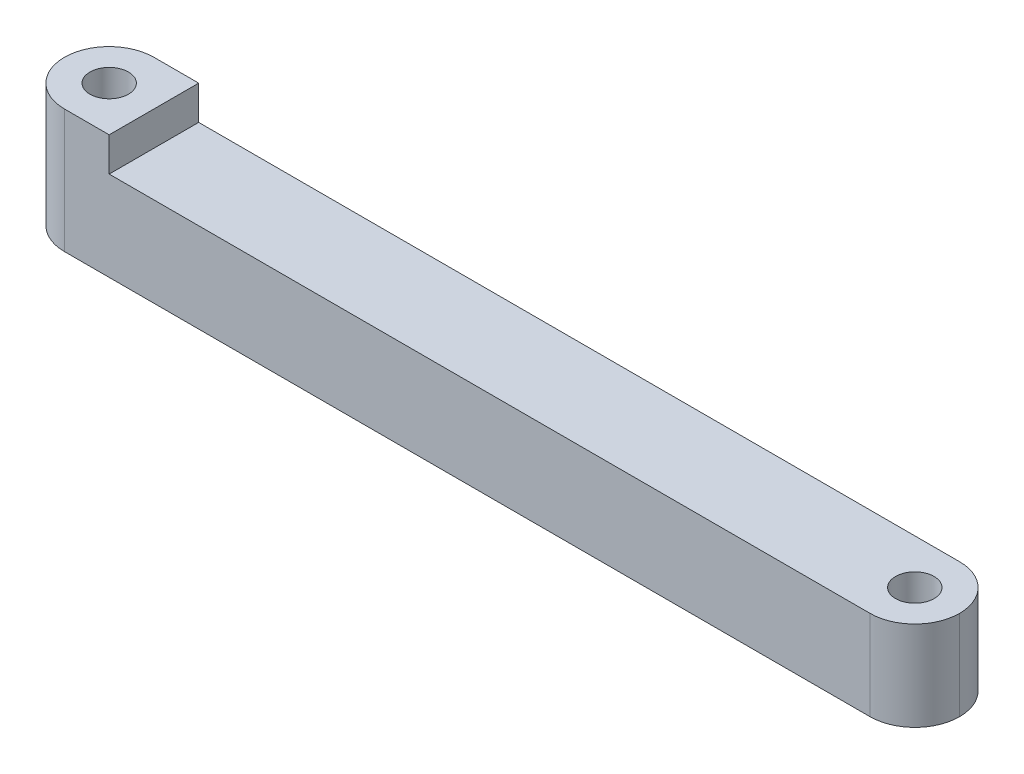
ISO-10303-21;
HEADER;
FILE_DESCRIPTION(('STEP AP214'),'2;1');
FILE_NAME('part.step','',(''),(''),'','','');
FILE_SCHEMA(('AUTOMOTIVE_DESIGN { 1 0 10303 214 1 1 1 1 }'));
ENDSEC;
DATA;
#1=APPLICATION_CONTEXT('core data for automotive mechanical design processes');
#2=APPLICATION_PROTOCOL_DEFINITION('international standard','automotive_design',2000,#1);
#3=PRODUCT_CONTEXT('',#1,'mechanical');
#4=PRODUCT('Part','Part','',(#3));
#5=PRODUCT_RELATED_PRODUCT_CATEGORY('part','',(#4));
#6=PRODUCT_DEFINITION_FORMATION('','',#4);
#7=PRODUCT_DEFINITION_CONTEXT('part definition',#1,'design');
#8=PRODUCT_DEFINITION('design','',#6,#7);
#9=PRODUCT_DEFINITION_SHAPE('','',#8);
#10=(LENGTH_UNIT() NAMED_UNIT(*) SI_UNIT(.MILLI.,.METRE.));
#11=(NAMED_UNIT(*) PLANE_ANGLE_UNIT() SI_UNIT($,.RADIAN.));
#12=(NAMED_UNIT(*) SI_UNIT($,.STERADIAN.) SOLID_ANGLE_UNIT());
#13=UNCERTAINTY_MEASURE_WITH_UNIT(LENGTH_MEASURE(1.E-05),#10,'distance_accuracy_value','');
#14=(GEOMETRIC_REPRESENTATION_CONTEXT(3) GLOBAL_UNCERTAINTY_ASSIGNED_CONTEXT((#13)) GLOBAL_UNIT_ASSIGNED_CONTEXT((#10,
#11,#12)) REPRESENTATION_CONTEXT('',''));
#15=CARTESIAN_POINT('',(0.,0.,0.));
#16=DIRECTION('',(0.,0.,1.));
#17=DIRECTION('',(1.,0.,0.));
#18=AXIS2_PLACEMENT_3D('',#15,#16,#17);
#19=CARTESIAN_POINT('',(-50.,5.,10.));
#20=DIRECTION('',(0.,-1.,0.));
#21=DIRECTION('',(0.,0.,-1.));
#22=AXIS2_PLACEMENT_3D('',#19,#20,#21);
#23=PLANE('',#22);
#24=CARTESIAN_POINT('',(45.,5.,5.));
#25=DIRECTION('',(0.,-1.,0.));
#26=DIRECTION('',(0.,0.,-1.));
#27=AXIS2_PLACEMENT_3D('',#24,#25,#26);
#28=CIRCLE('',#27,2.15);
#29=CARTESIAN_POINT('',(45.,5.,2.85));
#30=VERTEX_POINT('',#29);
#31=EDGE_CURVE('E194',#30,#30,#28,.T.);
#32=ORIENTED_EDGE('',*,*,#31,.T.);
#33=EDGE_LOOP('',(#32));
#34=FACE_BOUND('',#33,.T.);
#35=DIRECTION('',(-1.,0.,0.));
#36=VECTOR('',#35,1.);
#37=CARTESIAN_POINT('',(-50.,5.,10.));
#38=LINE('',#37,#36);
#39=CARTESIAN_POINT('',(45.,5.,10.));
#40=VERTEX_POINT('',#39);
#41=CARTESIAN_POINT('',(-40.,5.,10.));
#42=VERTEX_POINT('',#41);
#43=EDGE_CURVE('E145',#40,#42,#38,.T.);
#44=ORIENTED_EDGE('',*,*,#43,.F.);
#45=CARTESIAN_POINT('',(45.,5.,5.));
#46=DIRECTION('',(0.,-1.,0.));
#47=DIRECTION('',(0.,0.,-1.));
#48=AXIS2_PLACEMENT_3D('',#45,#46,#47);
#49=CIRCLE('',#48,5.);
#50=CARTESIAN_POINT('',(50.,5.,5.));
#51=VERTEX_POINT('',#50);
#52=EDGE_CURVE('E165',#40,#51,#49,.F.);
#53=ORIENTED_EDGE('',*,*,#52,.T.);
#54=CARTESIAN_POINT('',(45.,5.,5.));
#55=DIRECTION('',(0.,-1.,0.));
#56=DIRECTION('',(0.,0.,-1.));
#57=AXIS2_PLACEMENT_3D('',#54,#55,#56);
#58=CIRCLE('',#57,5.);
#59=CARTESIAN_POINT('',(45.,5.,0.));
#60=VERTEX_POINT('',#59);
#61=EDGE_CURVE('E162',#51,#60,#58,.F.);
#62=ORIENTED_EDGE('',*,*,#61,.T.);
#63=DIRECTION('',(-1.,0.,0.));
#64=VECTOR('',#63,1.);
#65=CARTESIAN_POINT('',(-50.,5.,0.));
#66=LINE('',#65,#64);
#67=CARTESIAN_POINT('',(-40.,5.,0.));
#68=VERTEX_POINT('',#67);
#69=EDGE_CURVE('E135',#60,#68,#66,.T.);
#70=ORIENTED_EDGE('',*,*,#69,.T.);
#71=DIRECTION('',(0.,0.,-1.));
#72=VECTOR('',#71,1.);
#73=CARTESIAN_POINT('',(-40.,5.,0.));
#74=LINE('',#73,#72);
#75=EDGE_CURVE('E130',#42,#68,#74,.T.);
#76=ORIENTED_EDGE('',*,*,#75,.F.);
#77=EDGE_LOOP('',(#44,#53,#62,#70,#76));
#78=FACE_BOUND('',#77,.T.);
#79=ADVANCED_FACE('F45',(#34,#78),#23,.F.);
#80=CARTESIAN_POINT('',(-50.,-5.,10.));
#81=DIRECTION('',(0.,1.,0.));
#82=DIRECTION('',(0.,0.,1.));
#83=AXIS2_PLACEMENT_3D('',#80,#81,#82);
#84=PLANE('',#83);
#85=CARTESIAN_POINT('',(-45.,-5.,5.));
#86=DIRECTION('',(0.,1.,0.));
#87=DIRECTION('',(0.,0.,1.));
#88=AXIS2_PLACEMENT_3D('',#85,#86,#87);
#89=CIRCLE('',#88,2.15);
#90=CARTESIAN_POINT('',(-45.,-5.,7.15));
#91=VERTEX_POINT('',#90);
#92=EDGE_CURVE('E199',#91,#91,#89,.T.);
#93=ORIENTED_EDGE('',*,*,#92,.T.);
#94=EDGE_LOOP('',(#93));
#95=FACE_BOUND('',#94,.T.);
#96=CARTESIAN_POINT('',(45.,-5.,5.));
#97=DIRECTION('',(0.,1.,0.));
#98=DIRECTION('',(0.,0.,1.));
#99=AXIS2_PLACEMENT_3D('',#96,#97,#98);
#100=CIRCLE('',#99,2.15);
#101=CARTESIAN_POINT('',(45.,-5.,7.15));
#102=VERTEX_POINT('',#101);
#103=EDGE_CURVE('E208',#102,#102,#100,.T.);
#104=ORIENTED_EDGE('',*,*,#103,.T.);
#105=EDGE_LOOP('',(#104));
#106=FACE_BOUND('',#105,.T.);
#107=CARTESIAN_POINT('',(45.,-5.,5.));
#108=DIRECTION('',(0.,1.,0.));
#109=DIRECTION('',(0.,0.,1.));
#110=AXIS2_PLACEMENT_3D('',#107,#108,#109);
#111=CIRCLE('',#110,5.);
#112=CARTESIAN_POINT('',(45.,-5.,0.));
#113=VERTEX_POINT('',#112);
#114=CARTESIAN_POINT('',(50.,-5.,5.));
#115=VERTEX_POINT('',#114);
#116=EDGE_CURVE('E174',#113,#115,#111,.F.);
#117=ORIENTED_EDGE('',*,*,#116,.T.);
#118=CARTESIAN_POINT('',(45.,-5.,5.));
#119=DIRECTION('',(0.,1.,0.));
#120=DIRECTION('',(0.,0.,1.));
#121=AXIS2_PLACEMENT_3D('',#118,#119,#120);
#122=CIRCLE('',#121,5.);
#123=CARTESIAN_POINT('',(45.,-5.,10.));
#124=VERTEX_POINT('',#123);
#125=EDGE_CURVE('E177',#115,#124,#122,.F.);
#126=ORIENTED_EDGE('',*,*,#125,.T.);
#127=DIRECTION('',(1.,0.,0.));
#128=VECTOR('',#127,1.);
#129=CARTESIAN_POINT('',(-50.,-5.,10.));
#130=LINE('',#129,#128);
#131=CARTESIAN_POINT('',(-45.,-5.,10.));
#132=VERTEX_POINT('',#131);
#133=EDGE_CURVE('E148',#132,#124,#130,.T.);
#134=ORIENTED_EDGE('',*,*,#133,.F.);
#135=CARTESIAN_POINT('',(-45.,-5.,5.));
#136=DIRECTION('',(0.,1.,0.));
#137=DIRECTION('',(0.,0.,1.));
#138=AXIS2_PLACEMENT_3D('',#135,#136,#137);
#139=CIRCLE('',#138,5.);
#140=CARTESIAN_POINT('',(-50.,-5.,5.));
#141=VERTEX_POINT('',#140);
#142=EDGE_CURVE('E168',#132,#141,#139,.F.);
#143=ORIENTED_EDGE('',*,*,#142,.T.);
#144=CARTESIAN_POINT('',(-45.,-5.,5.));
#145=DIRECTION('',(0.,1.,0.));
#146=DIRECTION('',(0.,0.,1.));
#147=AXIS2_PLACEMENT_3D('',#144,#145,#146);
#148=CIRCLE('',#147,5.);
#149=CARTESIAN_POINT('',(-45.,-5.,0.));
#150=VERTEX_POINT('',#149);
#151=EDGE_CURVE('E171',#141,#150,#148,.F.);
#152=ORIENTED_EDGE('',*,*,#151,.T.);
#153=DIRECTION('',(1.,0.,0.));
#154=VECTOR('',#153,1.);
#155=CARTESIAN_POINT('',(-50.,-5.,0.));
#156=LINE('',#155,#154);
#157=EDGE_CURVE('E140',#150,#113,#156,.T.);
#158=ORIENTED_EDGE('',*,*,#157,.T.);
#159=EDGE_LOOP('',(#117,#126,#134,#143,#152,#158));
#160=FACE_BOUND('',#159,.T.);
#161=ADVANCED_FACE('F235',(#95,#106,#160),#84,.F.);
#162=CARTESIAN_POINT('',(0.,0.,10.));
#163=DIRECTION('',(0.,0.,-1.));
#164=DIRECTION('',(-1.,0.,0.));
#165=AXIS2_PLACEMENT_3D('',#162,#163,#164);
#166=PLANE('',#165);
#167=ORIENTED_EDGE('',*,*,#133,.T.);
#168=DIRECTION('',(0.,1.,0.));
#169=VECTOR('',#168,1.);
#170=CARTESIAN_POINT('',(45.,0.,10.));
#171=LINE('',#170,#169);
#172=EDGE_CURVE('E158',#124,#40,#171,.T.);
#173=ORIENTED_EDGE('',*,*,#172,.T.);
#174=ORIENTED_EDGE('',*,*,#43,.T.);
#175=DIRECTION('',(0.,-1.,0.));
#176=VECTOR('',#175,1.);
#177=CARTESIAN_POINT('',(-40.,8.8,10.));
#178=LINE('',#177,#176);
#179=CARTESIAN_POINT('',(-40.,8.8,10.));
#180=VERTEX_POINT('',#179);
#181=EDGE_CURVE('E136',#180,#42,#178,.T.);
#182=ORIENTED_EDGE('',*,*,#181,.F.);
#183=DIRECTION('',(1.,0.,0.));
#184=VECTOR('',#183,1.);
#185=CARTESIAN_POINT('',(-40.,8.8,10.));
#186=LINE('',#185,#184);
#187=CARTESIAN_POINT('',(-45.,8.8,10.));
#188=VERTEX_POINT('',#187);
#189=EDGE_CURVE('E120',#188,#180,#186,.T.);
#190=ORIENTED_EDGE('',*,*,#189,.F.);
#191=DIRECTION('',(0.,-1.,0.));
#192=VECTOR('',#191,1.);
#193=CARTESIAN_POINT('',(-45.,0.,10.));
#194=LINE('',#193,#192);
#195=EDGE_CURVE('E151',#188,#132,#194,.T.);
#196=ORIENTED_EDGE('',*,*,#195,.T.);
#197=EDGE_LOOP('',(#167,#173,#174,#182,#190,#196));
#198=FACE_BOUND('',#197,.T.);
#199=ADVANCED_FACE('F240',(#198),#166,.F.);
#200=CARTESIAN_POINT('',(0.,0.,0.));
#201=DIRECTION('',(0.,0.,-1.));
#202=DIRECTION('',(-1.,0.,0.));
#203=AXIS2_PLACEMENT_3D('',#200,#201,#202);
#204=PLANE('',#203);
#205=ORIENTED_EDGE('',*,*,#69,.F.);
#206=DIRECTION('',(0.,1.,0.));
#207=VECTOR('',#206,1.);
#208=CARTESIAN_POINT('',(45.,-5.,0.));
#209=LINE('',#208,#207);
#210=EDGE_CURVE('E182',#60,#113,#209,.F.);
#211=ORIENTED_EDGE('',*,*,#210,.T.);
#212=ORIENTED_EDGE('',*,*,#157,.F.);
#213=DIRECTION('',(0.,-1.,0.));
#214=VECTOR('',#213,1.);
#215=CARTESIAN_POINT('',(-45.,8.8,0.));
#216=LINE('',#215,#214);
#217=CARTESIAN_POINT('',(-45.,8.8,0.));
#218=VERTEX_POINT('',#217);
#219=EDGE_CURVE('E118',#150,#218,#216,.F.);
#220=ORIENTED_EDGE('',*,*,#219,.T.);
#221=DIRECTION('',(-1.,0.,0.));
#222=VECTOR('',#221,1.);
#223=CARTESIAN_POINT('',(-40.,8.8,0.));
#224=LINE('',#223,#222);
#225=CARTESIAN_POINT('',(-40.,8.8,0.));
#226=VERTEX_POINT('',#225);
#227=EDGE_CURVE('E110',#226,#218,#224,.T.);
#228=ORIENTED_EDGE('',*,*,#227,.F.);
#229=DIRECTION('',(0.,-1.,0.));
#230=VECTOR('',#229,1.);
#231=CARTESIAN_POINT('',(-40.,8.8,0.));
#232=LINE('',#231,#230);
#233=EDGE_CURVE('E115',#226,#68,#232,.T.);
#234=ORIENTED_EDGE('',*,*,#233,.T.);
#235=EDGE_LOOP('',(#205,#211,#212,#220,#228,#234));
#236=FACE_BOUND('',#235,.T.);
#237=ADVANCED_FACE('F113',(#236),#204,.T.);
#238=CARTESIAN_POINT('',(-40.,8.8,0.));
#239=DIRECTION('',(-1.,0.,0.));
#240=DIRECTION('',(0.,0.,1.));
#241=AXIS2_PLACEMENT_3D('',#238,#239,#240);
#242=PLANE('',#241);
#243=ORIENTED_EDGE('',*,*,#75,.T.);
#244=ORIENTED_EDGE('',*,*,#233,.F.);
#245=DIRECTION('',(0.,0.,-1.));
#246=VECTOR('',#245,1.);
#247=CARTESIAN_POINT('',(-40.,8.8,0.));
#248=LINE('',#247,#246);
#249=EDGE_CURVE('E121',#180,#226,#248,.T.);
#250=ORIENTED_EDGE('',*,*,#249,.F.);
#251=ORIENTED_EDGE('',*,*,#181,.T.);
#252=EDGE_LOOP('',(#243,#244,#250,#251));
#253=FACE_BOUND('',#252,.T.);
#254=ADVANCED_FACE('F132',(#253),#242,.F.);
#255=CARTESIAN_POINT('',(0.,8.8,0.));
#256=DIRECTION('',(0.,-1.,0.));
#257=DIRECTION('',(0.,0.,-1.));
#258=AXIS2_PLACEMENT_3D('',#255,#256,#257);
#259=PLANE('',#258);
#260=CARTESIAN_POINT('',(-45.,8.8,5.));
#261=DIRECTION('',(0.,1.,0.));
#262=DIRECTION('',(0.,0.,1.));
#263=AXIS2_PLACEMENT_3D('',#260,#261,#262);
#264=CIRCLE('',#263,2.15);
#265=CARTESIAN_POINT('',(-45.,8.8,7.15));
#266=VERTEX_POINT('',#265);
#267=EDGE_CURVE('E205',#266,#266,#264,.T.);
#268=ORIENTED_EDGE('',*,*,#267,.F.);
#269=EDGE_LOOP('',(#268));
#270=FACE_BOUND('',#269,.T.);
#271=ORIENTED_EDGE('',*,*,#227,.T.);
#272=CARTESIAN_POINT('',(-45.,8.8,5.));
#273=DIRECTION('',(0.,-1.,0.));
#274=DIRECTION('',(0.,0.,-1.));
#275=AXIS2_PLACEMENT_3D('',#272,#273,#274);
#276=CIRCLE('',#275,5.);
#277=CARTESIAN_POINT('',(-50.,8.8,5.));
#278=VERTEX_POINT('',#277);
#279=EDGE_CURVE('E11',#218,#278,#276,.F.);
#280=ORIENTED_EDGE('',*,*,#279,.T.);
#281=CARTESIAN_POINT('',(-45.,8.8,5.));
#282=DIRECTION('',(0.,-1.,0.));
#283=DIRECTION('',(0.,0.,-1.));
#284=AXIS2_PLACEMENT_3D('',#281,#282,#283);
#285=CIRCLE('',#284,5.);
#286=EDGE_CURVE('E55',#278,#188,#285,.F.);
#287=ORIENTED_EDGE('',*,*,#286,.T.);
#288=ORIENTED_EDGE('',*,*,#189,.T.);
#289=ORIENTED_EDGE('',*,*,#249,.T.);
#290=EDGE_LOOP('',(#271,#280,#287,#288,#289));
#291=FACE_BOUND('',#290,.T.);
#292=ADVANCED_FACE('F124',(#270,#291),#259,.F.);
#293=CARTESIAN_POINT('',(45.,-5.,5.));
#294=DIRECTION('',(0.,-1.,0.));
#295=DIRECTION('',(0.,0.,-1.));
#296=AXIS2_PLACEMENT_3D('',#293,#294,#295);
#297=CYLINDRICAL_SURFACE('',#296,5.);
#298=DIRECTION('',(0.,1.,0.));
#299=VECTOR('',#298,1.);
#300=CARTESIAN_POINT('',(50.,5.,5.));
#301=LINE('',#300,#299);
#302=EDGE_CURVE('E186',#115,#51,#301,.T.);
#303=ORIENTED_EDGE('',*,*,#302,.F.);
#304=ORIENTED_EDGE('',*,*,#116,.F.);
#305=ORIENTED_EDGE('',*,*,#210,.F.);
#306=ORIENTED_EDGE('',*,*,#61,.F.);
#307=EDGE_LOOP('',(#303,#304,#305,#306));
#308=FACE_BOUND('',#307,.T.);
#309=ADVANCED_FACE('F221',(#308),#297,.T.);
#310=CARTESIAN_POINT('',(45.,0.,5.));
#311=DIRECTION('',(0.,1.,0.));
#312=DIRECTION('',(0.,0.,1.));
#313=AXIS2_PLACEMENT_3D('',#310,#311,#312);
#314=CYLINDRICAL_SURFACE('',#313,5.);
#315=ORIENTED_EDGE('',*,*,#125,.F.);
#316=ORIENTED_EDGE('',*,*,#302,.T.);
#317=ORIENTED_EDGE('',*,*,#52,.F.);
#318=ORIENTED_EDGE('',*,*,#172,.F.);
#319=EDGE_LOOP('',(#315,#316,#317,#318));
#320=FACE_BOUND('',#319,.T.);
#321=ADVANCED_FACE('F228',(#320),#314,.T.);
#322=CARTESIAN_POINT('',(-45.,0.,5.));
#323=DIRECTION('',(0.,-1.,0.));
#324=DIRECTION('',(0.,0.,-1.));
#325=AXIS2_PLACEMENT_3D('',#322,#323,#324);
#326=CYLINDRICAL_SURFACE('',#325,5.);
#327=ORIENTED_EDGE('',*,*,#195,.F.);
#328=ORIENTED_EDGE('',*,*,#286,.F.);
#329=DIRECTION('',(0.,-1.,0.));
#330=VECTOR('',#329,1.);
#331=CARTESIAN_POINT('',(-50.,-5.,5.));
#332=LINE('',#331,#330);
#333=EDGE_CURVE('E49',#141,#278,#332,.F.);
#334=ORIENTED_EDGE('',*,*,#333,.F.);
#335=ORIENTED_EDGE('',*,*,#142,.F.);
#336=EDGE_LOOP('',(#327,#328,#334,#335));
#337=FACE_BOUND('',#336,.T.);
#338=ADVANCED_FACE('F47',(#337),#326,.T.);
#339=CARTESIAN_POINT('',(-45.,-5.,5.));
#340=DIRECTION('',(0.,1.,0.));
#341=DIRECTION('',(0.,0.,1.));
#342=AXIS2_PLACEMENT_3D('',#339,#340,#341);
#343=CYLINDRICAL_SURFACE('',#342,5.);
#344=ORIENTED_EDGE('',*,*,#279,.F.);
#345=ORIENTED_EDGE('',*,*,#219,.F.);
#346=ORIENTED_EDGE('',*,*,#151,.F.);
#347=ORIENTED_EDGE('',*,*,#333,.T.);
#348=EDGE_LOOP('',(#344,#345,#346,#347));
#349=FACE_BOUND('',#348,.T.);
#350=ADVANCED_FACE('F247',(#349),#343,.T.);
#351=CARTESIAN_POINT('',(-45.,-5.,5.));
#352=DIRECTION('',(0.,1.,0.));
#353=DIRECTION('',(0.,0.,1.));
#354=AXIS2_PLACEMENT_3D('',#351,#352,#353);
#355=CYLINDRICAL_SURFACE('',#354,2.15);
#356=ORIENTED_EDGE('',*,*,#92,.F.);
#357=EDGE_LOOP('',(#356));
#358=FACE_BOUND('',#357,.T.);
#359=ORIENTED_EDGE('',*,*,#267,.T.);
#360=EDGE_LOOP('',(#359));
#361=FACE_BOUND('',#360,.T.);
#362=ADVANCED_FACE('F218',(#358,#361),#355,.F.);
#363=CARTESIAN_POINT('',(45.,-5.,5.));
#364=DIRECTION('',(0.,1.,0.));
#365=DIRECTION('',(0.,0.,1.));
#366=AXIS2_PLACEMENT_3D('',#363,#364,#365);
#367=CYLINDRICAL_SURFACE('',#366,2.15);
#368=ORIENTED_EDGE('',*,*,#103,.F.);
#369=EDGE_LOOP('',(#368));
#370=FACE_BOUND('',#369,.T.);
#371=ORIENTED_EDGE('',*,*,#31,.F.);
#372=EDGE_LOOP('',(#371));
#373=FACE_BOUND('',#372,.T.);
#374=ADVANCED_FACE('F251',(#370,#373),#367,.F.);
#375=CLOSED_SHELL('',(#79,#161,#199,#237,#254,#292,#309,#321,#338,#350,#362,#374));
#376=MANIFOLD_SOLID_BREP('B2',#375);
#377=ADVANCED_BREP_SHAPE_REPRESENTATION('',(#18,#376),#14);
#378=SHAPE_DEFINITION_REPRESENTATION(#9,#377);
ENDSEC;
END-ISO-10303-21;
